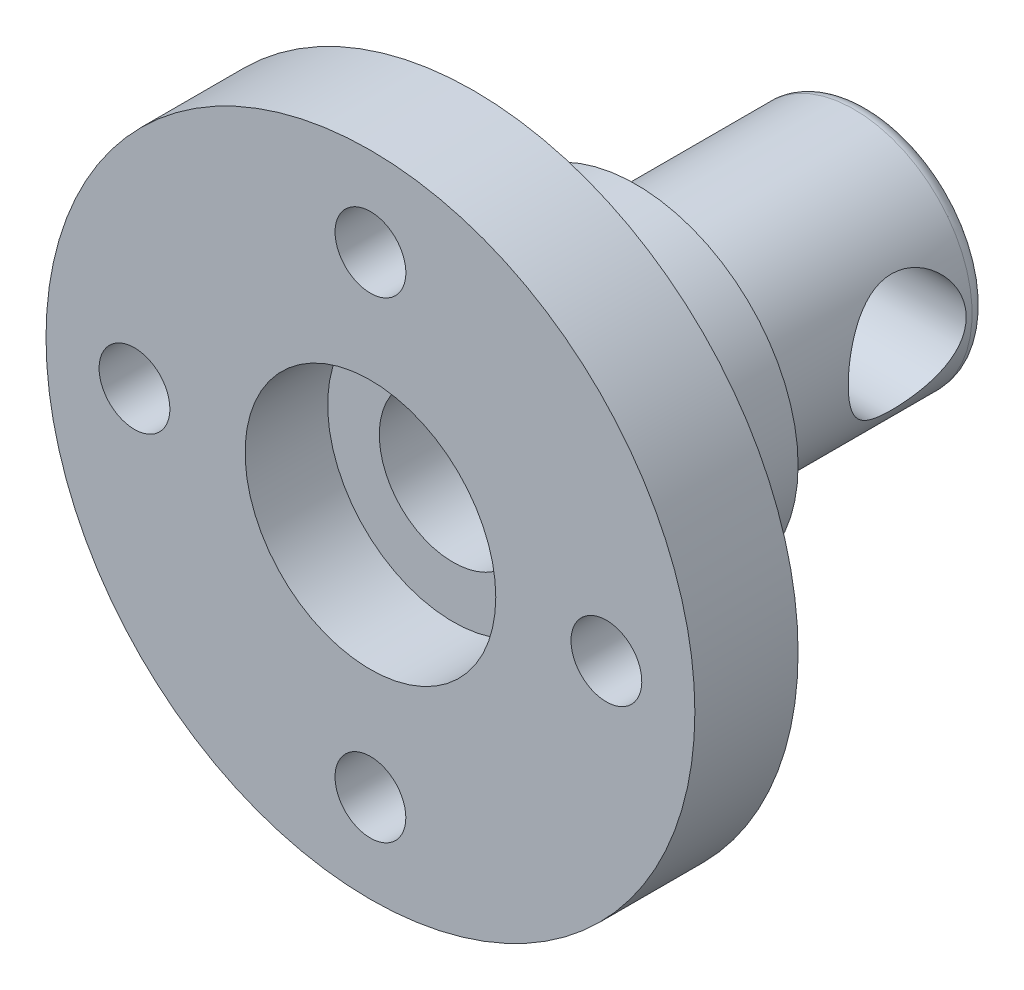
ISO-10303-21;
HEADER;
FILE_DESCRIPTION(('STEP AP214'),'2;1');
FILE_NAME('part.step','',(''),(''),'','','');
FILE_SCHEMA(('AUTOMOTIVE_DESIGN { 1 0 10303 214 1 1 1 1 }'));
ENDSEC;
DATA;
#1=APPLICATION_CONTEXT('core data for automotive mechanical design processes');
#2=APPLICATION_PROTOCOL_DEFINITION('international standard','automotive_design',2000,#1);
#3=PRODUCT_CONTEXT('',#1,'mechanical');
#4=PRODUCT('Part','Part','',(#3));
#5=PRODUCT_RELATED_PRODUCT_CATEGORY('part','',(#4));
#6=PRODUCT_DEFINITION_FORMATION('','',#4);
#7=PRODUCT_DEFINITION_CONTEXT('part definition',#1,'design');
#8=PRODUCT_DEFINITION('design','',#6,#7);
#9=PRODUCT_DEFINITION_SHAPE('','',#8);
#10=(LENGTH_UNIT() NAMED_UNIT(*) SI_UNIT(.MILLI.,.METRE.));
#11=(NAMED_UNIT(*) PLANE_ANGLE_UNIT() SI_UNIT($,.RADIAN.));
#12=(NAMED_UNIT(*) SI_UNIT($,.STERADIAN.) SOLID_ANGLE_UNIT());
#13=UNCERTAINTY_MEASURE_WITH_UNIT(LENGTH_MEASURE(1.E-05),#10,'distance_accuracy_value','');
#14=(GEOMETRIC_REPRESENTATION_CONTEXT(3) GLOBAL_UNCERTAINTY_ASSIGNED_CONTEXT((#13)) GLOBAL_UNIT_ASSIGNED_CONTEXT((#10,
#11,#12)) REPRESENTATION_CONTEXT('',''));
#15=CARTESIAN_POINT('',(0.,0.,0.));
#16=DIRECTION('',(0.,0.,1.));
#17=DIRECTION('',(1.,0.,0.));
#18=AXIS2_PLACEMENT_3D('',#15,#16,#17);
#19=CARTESIAN_POINT('',(0.,0.,3.5));
#20=DIRECTION('',(0.,0.,-1.));
#21=DIRECTION('',(-1.,0.,0.));
#22=AXIS2_PLACEMENT_3D('',#19,#20,#21);
#23=CYLINDRICAL_SURFACE('',#22,11.);
#24=CARTESIAN_POINT('',(0.,0.,3.5));
#25=DIRECTION('',(0.,0.,1.));
#26=DIRECTION('',(1.,0.,0.));
#27=AXIS2_PLACEMENT_3D('',#24,#25,#26);
#28=CIRCLE('',#27,11.);
#29=CARTESIAN_POINT('',(11.,0.,3.5));
#30=VERTEX_POINT('',#29);
#31=EDGE_CURVE('E51',#30,#30,#28,.T.);
#32=ORIENTED_EDGE('',*,*,#31,.F.);
#33=EDGE_LOOP('',(#32));
#34=FACE_BOUND('',#33,.T.);
#35=CARTESIAN_POINT('',(0.,0.,0.));
#36=DIRECTION('',(0.,0.,1.));
#37=DIRECTION('',(1.,0.,0.));
#38=AXIS2_PLACEMENT_3D('',#35,#36,#37);
#39=CIRCLE('',#38,11.);
#40=CARTESIAN_POINT('',(11.,0.,0.));
#41=VERTEX_POINT('',#40);
#42=EDGE_CURVE('E165',#41,#41,#39,.T.);
#43=ORIENTED_EDGE('',*,*,#42,.T.);
#44=EDGE_LOOP('',(#43));
#45=FACE_BOUND('',#44,.T.);
#46=ADVANCED_FACE('F36',(#34,#45),#23,.T.);
#47=CARTESIAN_POINT('',(0.,0.,3.5));
#48=DIRECTION('',(0.,0.,1.));
#49=DIRECTION('',(1.,0.,0.));
#50=AXIS2_PLACEMENT_3D('',#47,#48,#49);
#51=PLANE('',#50);
#52=CARTESIAN_POINT('',(-8.,0.,3.5));
#53=DIRECTION('',(0.,0.,-1.));
#54=DIRECTION('',(0.,-1.,0.));
#55=AXIS2_PLACEMENT_3D('',#52,#53,#54);
#56=CIRCLE('',#55,1.2);
#57=CARTESIAN_POINT('',(-8.,-1.20000000000003,3.5));
#58=VERTEX_POINT('',#57);
#59=EDGE_CURVE('E135',#58,#58,#56,.T.);
#60=ORIENTED_EDGE('',*,*,#59,.T.);
#61=EDGE_LOOP('',(#60));
#62=FACE_BOUND('',#61,.T.);
#63=CARTESIAN_POINT('',(0.,-8.,3.5));
#64=DIRECTION('',(0.,0.,-1.));
#65=DIRECTION('',(1.,0.,0.));
#66=AXIS2_PLACEMENT_3D('',#63,#64,#65);
#67=CIRCLE('',#66,1.2);
#68=CARTESIAN_POINT('',(1.2,-8.,3.5));
#69=VERTEX_POINT('',#68);
#70=EDGE_CURVE('E140',#69,#69,#67,.T.);
#71=ORIENTED_EDGE('',*,*,#70,.T.);
#72=EDGE_LOOP('',(#71));
#73=FACE_BOUND('',#72,.T.);
#74=CARTESIAN_POINT('',(8.,0.,3.5));
#75=DIRECTION('',(0.,0.,-1.));
#76=DIRECTION('',(0.,1.,0.));
#77=AXIS2_PLACEMENT_3D('',#74,#75,#76);
#78=CIRCLE('',#77,1.2);
#79=CARTESIAN_POINT('',(7.99999999999999,1.20000000000008,3.5));
#80=VERTEX_POINT('',#79);
#81=EDGE_CURVE('E151',#80,#80,#78,.T.);
#82=ORIENTED_EDGE('',*,*,#81,.T.);
#83=EDGE_LOOP('',(#82));
#84=FACE_BOUND('',#83,.T.);
#85=CARTESIAN_POINT('',(0.,8.,3.5));
#86=DIRECTION('',(0.,0.,-1.));
#87=DIRECTION('',(-1.,0.,0.));
#88=AXIS2_PLACEMENT_3D('',#85,#86,#87);
#89=CIRCLE('',#88,1.2);
#90=CARTESIAN_POINT('',(-1.2,8.,3.5));
#91=VERTEX_POINT('',#90);
#92=EDGE_CURVE('E156',#91,#91,#89,.T.);
#93=ORIENTED_EDGE('',*,*,#92,.T.);
#94=EDGE_LOOP('',(#93));
#95=FACE_BOUND('',#94,.T.);
#96=CARTESIAN_POINT('',(0.,0.,3.5));
#97=DIRECTION('',(0.,0.,1.));
#98=DIRECTION('',(1.,0.,0.));
#99=AXIS2_PLACEMENT_3D('',#96,#97,#98);
#100=CIRCLE('',#99,4.25);
#101=CARTESIAN_POINT('',(4.25,0.,3.5));
#102=VERTEX_POINT('',#101);
#103=EDGE_CURVE('E159',#102,#102,#100,.T.);
#104=ORIENTED_EDGE('',*,*,#103,.F.);
#105=EDGE_LOOP('',(#104));
#106=FACE_BOUND('',#105,.T.);
#107=ORIENTED_EDGE('',*,*,#31,.T.);
#108=EDGE_LOOP('',(#107));
#109=FACE_BOUND('',#108,.T.);
#110=ADVANCED_FACE('F92',(#62,#73,#84,#95,#106,#109),#51,.T.);
#111=CARTESIAN_POINT('',(0.,0.,0.));
#112=DIRECTION('',(0.,0.,1.));
#113=DIRECTION('',(1.,0.,0.));
#114=AXIS2_PLACEMENT_3D('',#111,#112,#113);
#115=PLANE('',#114);
#116=CARTESIAN_POINT('',(0.,0.,0.));
#117=DIRECTION('',(0.,0.,1.));
#118=DIRECTION('',(1.,0.,0.));
#119=AXIS2_PLACEMENT_3D('',#116,#117,#118);
#120=CIRCLE('',#119,5.5);
#121=CARTESIAN_POINT('',(5.5,0.,0.));
#122=VERTEX_POINT('',#121);
#123=EDGE_CURVE('E47',#122,#122,#120,.F.);
#124=ORIENTED_EDGE('',*,*,#123,.F.);
#125=EDGE_LOOP('',(#124));
#126=FACE_BOUND('',#125,.T.);
#127=CARTESIAN_POINT('',(-8.,0.,0.));
#128=DIRECTION('',(0.,0.,-1.));
#129=DIRECTION('',(0.,-1.,0.));
#130=AXIS2_PLACEMENT_3D('',#127,#128,#129);
#131=CIRCLE('',#130,1.2);
#132=CARTESIAN_POINT('',(-8.,-1.20000000000003,0.));
#133=VERTEX_POINT('',#132);
#134=EDGE_CURVE('E138',#133,#133,#131,.T.);
#135=ORIENTED_EDGE('',*,*,#134,.F.);
#136=EDGE_LOOP('',(#135));
#137=FACE_BOUND('',#136,.T.);
#138=CARTESIAN_POINT('',(0.,-8.,0.));
#139=DIRECTION('',(0.,0.,-1.));
#140=DIRECTION('',(1.,0.,0.));
#141=AXIS2_PLACEMENT_3D('',#138,#139,#140);
#142=CIRCLE('',#141,1.2);
#143=CARTESIAN_POINT('',(1.2,-8.,0.));
#144=VERTEX_POINT('',#143);
#145=EDGE_CURVE('E145',#144,#144,#142,.T.);
#146=ORIENTED_EDGE('',*,*,#145,.F.);
#147=EDGE_LOOP('',(#146));
#148=FACE_BOUND('',#147,.T.);
#149=CARTESIAN_POINT('',(8.,0.,0.));
#150=DIRECTION('',(0.,0.,-1.));
#151=DIRECTION('',(0.,1.,0.));
#152=AXIS2_PLACEMENT_3D('',#149,#150,#151);
#153=CIRCLE('',#152,1.2);
#154=CARTESIAN_POINT('',(7.99999999999999,1.20000000000008,0.));
#155=VERTEX_POINT('',#154);
#156=EDGE_CURVE('E67',#155,#155,#153,.T.);
#157=ORIENTED_EDGE('',*,*,#156,.F.);
#158=EDGE_LOOP('',(#157));
#159=FACE_BOUND('',#158,.T.);
#160=CARTESIAN_POINT('',(0.,8.,0.));
#161=DIRECTION('',(0.,0.,-1.));
#162=DIRECTION('',(-1.,0.,0.));
#163=AXIS2_PLACEMENT_3D('',#160,#161,#162);
#164=CIRCLE('',#163,1.2);
#165=CARTESIAN_POINT('',(-1.2,8.,0.));
#166=VERTEX_POINT('',#165);
#167=EDGE_CURVE('E142',#166,#166,#164,.T.);
#168=ORIENTED_EDGE('',*,*,#167,.F.);
#169=EDGE_LOOP('',(#168));
#170=FACE_BOUND('',#169,.T.);
#171=ORIENTED_EDGE('',*,*,#42,.F.);
#172=EDGE_LOOP('',(#171));
#173=FACE_BOUND('',#172,.T.);
#174=ADVANCED_FACE('F97',(#126,#137,#148,#159,#170,#173),#115,.F.);
#175=CARTESIAN_POINT('',(0.,0.,0.7));
#176=DIRECTION('',(0.,0.,1.));
#177=DIRECTION('',(1.,0.,0.));
#178=AXIS2_PLACEMENT_3D('',#175,#176,#177);
#179=CYLINDRICAL_SURFACE('',#178,4.25);
#180=CARTESIAN_POINT('',(0.,0.,0.7));
#181=DIRECTION('',(0.,0.,1.));
#182=DIRECTION('',(1.,0.,0.));
#183=AXIS2_PLACEMENT_3D('',#180,#181,#182);
#184=CIRCLE('',#183,4.25);
#185=CARTESIAN_POINT('',(4.25,0.,0.7));
#186=VERTEX_POINT('',#185);
#187=EDGE_CURVE('E162',#186,#186,#184,.T.);
#188=ORIENTED_EDGE('',*,*,#187,.F.);
#189=EDGE_LOOP('',(#188));
#190=FACE_BOUND('',#189,.T.);
#191=ORIENTED_EDGE('',*,*,#103,.T.);
#192=EDGE_LOOP('',(#191));
#193=FACE_BOUND('',#192,.T.);
#194=ADVANCED_FACE('F104',(#190,#193),#179,.F.);
#195=CARTESIAN_POINT('',(0.,0.,0.7));
#196=DIRECTION('',(0.,0.,1.));
#197=DIRECTION('',(1.,0.,0.));
#198=AXIS2_PLACEMENT_3D('',#195,#196,#197);
#199=PLANE('',#198);
#200=CARTESIAN_POINT('',(0.,0.,0.7));
#201=DIRECTION('',(0.,0.,1.));
#202=DIRECTION('',(1.,0.,0.));
#203=AXIS2_PLACEMENT_3D('',#200,#201,#202);
#204=CIRCLE('',#203,2.5);
#205=CARTESIAN_POINT('',(2.5,0.,0.7));
#206=VERTEX_POINT('',#205);
#207=EDGE_CURVE('E194',#206,#206,#204,.T.);
#208=ORIENTED_EDGE('',*,*,#207,.F.);
#209=EDGE_LOOP('',(#208));
#210=FACE_BOUND('',#209,.T.);
#211=ORIENTED_EDGE('',*,*,#187,.T.);
#212=EDGE_LOOP('',(#211));
#213=FACE_BOUND('',#212,.T.);
#214=ADVANCED_FACE('F109',(#210,#213),#199,.T.);
#215=CARTESIAN_POINT('',(0.,8.,3.5));
#216=DIRECTION('',(0.,0.,-1.));
#217=DIRECTION('',(-1.,0.,0.));
#218=AXIS2_PLACEMENT_3D('',#215,#216,#217);
#219=CYLINDRICAL_SURFACE('',#218,1.2);
#220=ORIENTED_EDGE('',*,*,#92,.F.);
#221=EDGE_LOOP('',(#220));
#222=FACE_BOUND('',#221,.T.);
#223=ORIENTED_EDGE('',*,*,#167,.T.);
#224=EDGE_LOOP('',(#223));
#225=FACE_BOUND('',#224,.T.);
#226=ADVANCED_FACE('F113',(#222,#225),#219,.F.);
#227=CARTESIAN_POINT('',(8.,0.,3.5));
#228=DIRECTION('',(0.,0.,-1.));
#229=DIRECTION('',(-1.,0.,0.));
#230=AXIS2_PLACEMENT_3D('',#227,#228,#229);
#231=CYLINDRICAL_SURFACE('',#230,1.2);
#232=ORIENTED_EDGE('',*,*,#81,.F.);
#233=EDGE_LOOP('',(#232));
#234=FACE_BOUND('',#233,.T.);
#235=ORIENTED_EDGE('',*,*,#156,.T.);
#236=EDGE_LOOP('',(#235));
#237=FACE_BOUND('',#236,.T.);
#238=ADVANCED_FACE('F117',(#234,#237),#231,.F.);
#239=CARTESIAN_POINT('',(0.,-8.,3.5));
#240=DIRECTION('',(0.,0.,-1.));
#241=DIRECTION('',(-1.,0.,0.));
#242=AXIS2_PLACEMENT_3D('',#239,#240,#241);
#243=CYLINDRICAL_SURFACE('',#242,1.2);
#244=ORIENTED_EDGE('',*,*,#70,.F.);
#245=EDGE_LOOP('',(#244));
#246=FACE_BOUND('',#245,.T.);
#247=ORIENTED_EDGE('',*,*,#145,.T.);
#248=EDGE_LOOP('',(#247));
#249=FACE_BOUND('',#248,.T.);
#250=ADVANCED_FACE('F121',(#246,#249),#243,.F.);
#251=CARTESIAN_POINT('',(-8.,0.,3.5));
#252=DIRECTION('',(0.,0.,-1.));
#253=DIRECTION('',(-1.,0.,0.));
#254=AXIS2_PLACEMENT_3D('',#251,#252,#253);
#255=CYLINDRICAL_SURFACE('',#254,1.2);
#256=ORIENTED_EDGE('',*,*,#59,.F.);
#257=EDGE_LOOP('',(#256));
#258=FACE_BOUND('',#257,.T.);
#259=ORIENTED_EDGE('',*,*,#134,.T.);
#260=EDGE_LOOP('',(#259));
#261=FACE_BOUND('',#260,.T.);
#262=ADVANCED_FACE('F124',(#258,#261),#255,.F.);
#263=CARTESIAN_POINT('',(0.,0.,-5.5));
#264=DIRECTION('',(0.,0.,1.));
#265=DIRECTION('',(1.,0.,0.));
#266=AXIS2_PLACEMENT_3D('',#263,#264,#265);
#267=CYLINDRICAL_SURFACE('',#266,5.5);
#268=CARTESIAN_POINT('',(0.,0.,-5.5));
#269=DIRECTION('',(0.,0.,-1.));
#270=DIRECTION('',(-1.,0.,0.));
#271=AXIS2_PLACEMENT_3D('',#268,#269,#270);
#272=CIRCLE('',#271,5.5);
#273=CARTESIAN_POINT('',(-5.5,0.,-5.5));
#274=VERTEX_POINT('',#273);
#275=EDGE_CURVE('E58',#274,#274,#272,.T.);
#276=ORIENTED_EDGE('',*,*,#275,.F.);
#277=EDGE_LOOP('',(#276));
#278=FACE_BOUND('',#277,.T.);
#279=ORIENTED_EDGE('',*,*,#123,.T.);
#280=EDGE_LOOP('',(#279));
#281=FACE_BOUND('',#280,.T.);
#282=ADVANCED_FACE('F82',(#278,#281),#267,.T.);
#283=CARTESIAN_POINT('',(0.,0.,-5.5));
#284=DIRECTION('',(0.,0.,-1.));
#285=DIRECTION('',(-1.,0.,0.));
#286=AXIS2_PLACEMENT_3D('',#283,#284,#285);
#287=PLANE('',#286);
#288=CARTESIAN_POINT('',(0.,0.,-5.5));
#289=DIRECTION('',(0.,0.,-1.));
#290=DIRECTION('',(-1.,0.,0.));
#291=AXIS2_PLACEMENT_3D('',#288,#289,#290);
#292=CIRCLE('',#291,4.);
#293=CARTESIAN_POINT('',(-4.,0.,-5.5));
#294=VERTEX_POINT('',#293);
#295=EDGE_CURVE('E54',#294,#294,#292,.T.);
#296=ORIENTED_EDGE('',*,*,#295,.F.);
#297=EDGE_LOOP('',(#296));
#298=FACE_BOUND('',#297,.T.);
#299=ORIENTED_EDGE('',*,*,#275,.T.);
#300=EDGE_LOOP('',(#299));
#301=FACE_BOUND('',#300,.T.);
#302=ADVANCED_FACE('F86',(#298,#301),#287,.T.);
#303=CARTESIAN_POINT('',(0.,0.,-13.4));
#304=DIRECTION('',(0.,0.,-1.));
#305=DIRECTION('',(-1.,0.,0.));
#306=AXIS2_PLACEMENT_3D('',#303,#304,#305);
#307=PLANE('',#306);
#308=CARTESIAN_POINT('',(0.,0.,-13.4));
#309=DIRECTION('',(0.,0.,-1.));
#310=DIRECTION('',(-1.,0.,0.));
#311=AXIS2_PLACEMENT_3D('',#308,#309,#310);
#312=CIRCLE('',#311,3.5);
#313=CARTESIAN_POINT('',(-3.5,0.,-13.4));
#314=VERTEX_POINT('',#313);
#315=EDGE_CURVE('E43',#314,#314,#312,.T.);
#316=ORIENTED_EDGE('',*,*,#315,.T.);
#317=EDGE_LOOP('',(#316));
#318=FACE_BOUND('',#317,.T.);
#319=ADVANCED_FACE('F80',(#318),#307,.T.);
#320=CARTESIAN_POINT('',(-11.,0.,-10.7));
#321=DIRECTION('',(1.,0.,0.));
#322=DIRECTION('',(0.,0.,-1.));
#323=AXIS2_PLACEMENT_3D('',#320,#321,#322);
#324=CYLINDRICAL_SURFACE('',#323,2.);
#325=CARTESIAN_POINT('',(-4.,0.,-12.7));
#326=CARTESIAN_POINT('',(-3.99999426810082,0.105143925902467,-12.6999933953656));
#327=CARTESIAN_POINT('',(-3.99580982039513,0.210413199395125,-12.6916598537579));
#328=CARTESIAN_POINT('',(-3.97948312074314,0.417840470537792,-12.6586942393169));
#329=CARTESIAN_POINT('',(-3.96732575657839,0.519992173427259,-12.6340312140044));
#330=CARTESIAN_POINT('',(-3.93632558806751,0.717867089760897,-12.5696123827667));
#331=CARTESIAN_POINT('',(-3.91750878355075,0.813613605878292,-12.5299152315041));
#332=CARTESIAN_POINT('',(-3.87491553031523,0.996945233613198,-12.43685875727));
#333=CARTESIAN_POINT('',(-3.8511394726705,1.08453098798012,-12.3835005115023));
#334=CARTESIAN_POINT('',(-3.79912516516124,1.25501563552382,-12.2609655010294));
#335=CARTESIAN_POINT('',(-3.77070398255074,1.33731042224422,-12.1910270415207));
#336=CARTESIAN_POINT('',(-3.71319940493486,1.48955888973396,-12.0389570415059));
#337=CARTESIAN_POINT('',(-3.68411552418069,1.55950316621353,-11.9568162964551));
#338=CARTESIAN_POINT('',(-3.62597902394695,1.69050400090056,-11.7750333009532));
#339=CARTESIAN_POINT('',(-3.59710373940264,1.75045067110327,-11.6745278033082));
#340=CARTESIAN_POINT('',(-3.54571957544641,1.85233645378139,-11.4632653280276));
#341=CARTESIAN_POINT('',(-3.52320615213979,1.89428842993267,-11.3525157425545));
#342=CARTESIAN_POINT('',(-3.48915734075617,1.95626488437718,-11.1306697891562));
#343=CARTESIAN_POINT('',(-3.47704543167427,1.97745171416088,-11.0199910958652));
#344=CARTESIAN_POINT('',(-3.46363779897055,2.00085398661769,-10.796042324441));
#345=CARTESIAN_POINT('',(-3.46233138686576,2.00308817674615,-10.6827749182577));
#346=CARTESIAN_POINT('',(-3.47021860514497,1.98937457434459,-10.4714279513693));
#347=CARTESIAN_POINT('',(-3.47817527324027,1.97556911907364,-10.3731519375539));
#348=CARTESIAN_POINT('',(-3.50152457467701,1.93387969811386,-10.1805561812539));
#349=CARTESIAN_POINT('',(-3.51691957663553,1.9059912477953,-10.0862377093894));
#350=CARTESIAN_POINT('',(-3.55374952825482,1.83641956077201,-9.90154173486868));
#351=CARTESIAN_POINT('',(-3.57531681327997,1.79443013423199,-9.81130720242842));
#352=CARTESIAN_POINT('',(-3.62206808562807,1.698083375336,-9.63873141481998));
#353=CARTESIAN_POINT('',(-3.64725369560381,1.64372048762493,-9.55639372879982));
#354=CARTESIAN_POINT('',(-3.70226315806572,1.51613210982558,-9.39095749451355));
#355=CARTESIAN_POINT('',(-3.73227020473492,1.44138891673856,-9.30908625284768));
#356=CARTESIAN_POINT('',(-3.79095246600814,1.27911115748275,-9.15852916281819));
#357=CARTESIAN_POINT('',(-3.81962703917602,1.19157051314857,-9.08984961593223));
#358=CARTESIAN_POINT('',(-3.87403974565928,1.0010330116637,-8.96462867794054));
#359=CARTESIAN_POINT('',(-3.89957968324015,0.897507183198817,-8.90879905510852));
#360=CARTESIAN_POINT('',(-3.94315762242485,0.680932430977593,-8.81580594191398));
#361=CARTESIAN_POINT('',(-3.96120157887106,0.567891152530552,-8.77862762996967));
#362=CARTESIAN_POINT('',(-3.98648667482871,0.345532983321405,-8.72704919256665));
#363=CARTESIAN_POINT('',(-3.9944987660262,0.236683061096652,-8.71101752850644));
#364=CARTESIAN_POINT('',(-4.00146026918207,0.0175591998987031,-8.69707053773103));
#365=CARTESIAN_POINT('',(-4.00041397442637,-0.0927140397398177,-8.69914662872106));
#366=CARTESIAN_POINT('',(-3.9898238450687,-0.302465943971974,-8.72041337683749));
#367=CARTESIAN_POINT('',(-3.98094491376337,-0.40211881609986,-8.73826506545999));
#368=CARTESIAN_POINT('',(-3.9564434262968,-0.596813784603882,-8.78847614379024));
#369=CARTESIAN_POINT('',(-3.94082012668824,-0.691855371382174,-8.82083713290699));
#370=CARTESIAN_POINT('',(-3.90368502827176,-0.877777216899145,-8.89999693286607));
#371=CARTESIAN_POINT('',(-3.88201763539261,-0.968460794011607,-8.94718210023258));
#372=CARTESIAN_POINT('',(-3.83487948634835,-1.14092272339854,-9.05421507129314));
#373=CARTESIAN_POINT('',(-3.80940711133877,-1.22269725955318,-9.11406826919079));
#374=CARTESIAN_POINT('',(-3.75416442672396,-1.38353537857843,-9.25152085066143));
#375=CARTESIAN_POINT('',(-3.72421769686998,-1.46154415563805,-9.3302857368903));
#376=CARTESIAN_POINT('',(-3.6652478321764,-1.60371264223771,-9.49985030255546));
#377=CARTESIAN_POINT('',(-3.63622534800094,-1.66786277142375,-9.59065823769584));
#378=CARTESIAN_POINT('',(-3.58102384412979,-1.78341582895804,-9.78728730834595));
#379=CARTESIAN_POINT('',(-3.55505059178121,-1.8340509916005,-9.89362253218896));
#380=CARTESIAN_POINT('',(-3.51148144588269,-1.91616565186941,-10.1150201351499));
#381=CARTESIAN_POINT('',(-3.493874764435,-1.94766983173403,-10.2300710529338));
#382=CARTESIAN_POINT('',(-3.47123002051604,-1.98772337493374,-10.4538204457694));
#383=CARTESIAN_POINT('',(-3.4651476693013,-1.9981859928109,-10.5620685068705));
#384=CARTESIAN_POINT('',(-3.46330709283206,-2.0013783087524,-10.778894134329));
#385=CARTESIAN_POINT('',(-3.4675443925278,-1.99411569324648,-10.8874715374757));
#386=CARTESIAN_POINT('',(-3.48475724102153,-1.96385225118662,-11.0909670030669));
#387=CARTESIAN_POINT('',(-3.49686188965317,-1.94241662868607,-11.1862009402895));
#388=CARTESIAN_POINT('',(-3.52742032375305,-1.88635071644882,-11.3716162388487));
#389=CARTESIAN_POINT('',(-3.54587615139337,-1.85171618231984,-11.4617959641841));
#390=CARTESIAN_POINT('',(-3.58857060729071,-1.76763149060113,-11.6412497019731));
#391=CARTESIAN_POINT('',(-3.61311444791841,-1.7173422756314,-11.7300558036581));
#392=CARTESIAN_POINT('',(-3.66470663269721,-1.60430194327478,-11.8985490723625));
#393=CARTESIAN_POINT('',(-3.69175627591221,-1.54154434248312,-11.9782314610422));
#394=CARTESIAN_POINT('',(-3.74924646316184,-1.39640665332275,-12.1362839647093));
#395=CARTESIAN_POINT('',(-3.77969966613256,-1.31256884599452,-12.2133182047006));
#396=CARTESIAN_POINT('',(-3.83755504519861,-1.13230961246639,-12.3525259668705));
#397=CARTESIAN_POINT('',(-3.8649555725239,-1.03588144661039,-12.4146914789398));
#398=CARTESIAN_POINT('',(-3.91396019133075,-0.831863193565892,-12.5224727254241));
#399=CARTESIAN_POINT('',(-3.93552192987866,-0.724199007553462,-12.5679683384729));
#400=CARTESIAN_POINT('',(-3.97002682597974,-0.501484202276173,-12.6396163355148));
#401=CARTESIAN_POINT('',(-3.98299446726136,-0.3864555991782,-12.6658236936114));
#402=CARTESIAN_POINT('',(-3.99390923826956,-0.22520389298179,-12.6877948221715));
#403=CARTESIAN_POINT('',(-3.99618730680502,-0.180323758883129,-12.6923652817327));
#404=CARTESIAN_POINT('',(-3.99923393953631,-0.090303463610183,-12.6984693310282));
#405=CARTESIAN_POINT('',(-4.00000246206762,-0.0451632952932568,-12.7000028369404));
#406=CARTESIAN_POINT('',(-4.,0.,-12.7));
#407=B_SPLINE_CURVE_WITH_KNOTS('',3,(#325,#326,#327,#328,#329,#330,#331,#332,#333,#334,#335,
#336,#337,#338,#339,#340,#341,#342,#343,#344,#345,#346,#347,#348,#349,#350,#351,#352,#353,#354,
#355,#356,#357,#358,#359,#360,#361,#362,#363,#364,#365,#366,#367,#368,#369,#370,#371,#372,#373,
#374,#375,#376,#377,#378,#379,#380,#381,#382,#383,#384,#385,#386,#387,#388,#389,#390,#391,#392,
#393,#394,#395,#396,#397,#398,#399,#400,#401,#402,#403,#404,#405,#406),.UNSPECIFIED.,.T.,.F.,(4,
2,2,2,2,2,2,2,2,2,2,2,2,2,2,2,2,2,2,2,2,2,2,2,2,2,2,2,2,2,2,2,2,2,2,2,2,2,2,2,4),(0.,
0.315248514840585,0.631096299418396,0.945724310984597,1.26032752116314,1.59396351743618,
1.92785247530807,2.28763452861505,2.64715895796562,2.98516024280459,3.32282714658041,
3.62011424818641,3.91749607851357,4.22180480336975,4.52625042520444,4.86929882667757,
5.21251069197373,5.57166044428881,5.93052433824559,6.25966580942691,6.58865129022952,
6.89213813012244,7.19565843261863,7.50785712055797,7.82018901496678,8.16319221288838,
8.50643177230863,8.86629364323451,9.22569023890901,9.55058615006093,9.87534119729357,
10.1691586049771,10.463070575767,10.7767291356057,11.0905512228726,11.4425048551434,
11.7946476676249,12.1492802732705,12.502898172423,12.6383056026783,12.7737167702213),.UNSPECIFIED.);
#408=CARTESIAN_POINT('',(-4.,0.,-12.7));
#409=VERTEX_POINT('',#408);
#410=EDGE_CURVE('E57',#409,#409,#407,.T.);
#411=ORIENTED_EDGE('',*,*,#410,.F.);
#412=EDGE_LOOP('',(#411));
#413=FACE_BOUND('',#412,.T.);
#414=CARTESIAN_POINT('',(4.,0.,-12.7));
#415=CARTESIAN_POINT('',(3.99999426810082,-0.105143925902467,-12.6999933953656));
#416=CARTESIAN_POINT('',(3.99580982039513,-0.210413199395125,-12.6916598537579));
#417=CARTESIAN_POINT('',(3.97948312074314,-0.417840470537792,-12.6586942393169));
#418=CARTESIAN_POINT('',(3.96732575657839,-0.519992173427259,-12.6340312140044));
#419=CARTESIAN_POINT('',(3.93632558806751,-0.717867089760897,-12.5696123827667));
#420=CARTESIAN_POINT('',(3.91750878355075,-0.813613605878292,-12.5299152315041));
#421=CARTESIAN_POINT('',(3.87491553031523,-0.996945233613198,-12.43685875727));
#422=CARTESIAN_POINT('',(3.8511394726705,-1.08453098798012,-12.3835005115023));
#423=CARTESIAN_POINT('',(3.79912516516124,-1.25501563552382,-12.2609655010294));
#424=CARTESIAN_POINT('',(3.77070398255074,-1.33731042224422,-12.1910270415207));
#425=CARTESIAN_POINT('',(3.71319940493486,-1.48955888973396,-12.0389570415059));
#426=CARTESIAN_POINT('',(3.68411552418069,-1.55950316621353,-11.9568162964551));
#427=CARTESIAN_POINT('',(3.62597902394695,-1.69050400090056,-11.7750333009532));
#428=CARTESIAN_POINT('',(3.59710373940264,-1.75045067110327,-11.6745278033082));
#429=CARTESIAN_POINT('',(3.54571957544641,-1.85233645378139,-11.4632653280276));
#430=CARTESIAN_POINT('',(3.52320615213979,-1.89428842993267,-11.3525157425545));
#431=CARTESIAN_POINT('',(3.48915734075617,-1.95626488437718,-11.1306697891562));
#432=CARTESIAN_POINT('',(3.47704543167427,-1.97745171416088,-11.0199910958652));
#433=CARTESIAN_POINT('',(3.46363779897055,-2.00085398661769,-10.796042324441));
#434=CARTESIAN_POINT('',(3.46233138686576,-2.00308817674615,-10.6827749182577));
#435=CARTESIAN_POINT('',(3.47021860514497,-1.98937457434459,-10.4714279513693));
#436=CARTESIAN_POINT('',(3.47817527324027,-1.97556911907364,-10.3731519375539));
#437=CARTESIAN_POINT('',(3.50152457467701,-1.93387969811386,-10.1805561812539));
#438=CARTESIAN_POINT('',(3.51691957663553,-1.9059912477953,-10.0862377093894));
#439=CARTESIAN_POINT('',(3.55374952825482,-1.83641956077201,-9.90154173486868));
#440=CARTESIAN_POINT('',(3.57531681327997,-1.79443013423199,-9.81130720242842));
#441=CARTESIAN_POINT('',(3.62206808562807,-1.698083375336,-9.63873141481998));
#442=CARTESIAN_POINT('',(3.64725369560381,-1.64372048762493,-9.55639372879982));
#443=CARTESIAN_POINT('',(3.70226315806572,-1.51613210982558,-9.39095749451355));
#444=CARTESIAN_POINT('',(3.73227020473492,-1.44138891673856,-9.30908625284768));
#445=CARTESIAN_POINT('',(3.79095246600814,-1.27911115748275,-9.15852916281819));
#446=CARTESIAN_POINT('',(3.81962703917602,-1.19157051314857,-9.08984961593223));
#447=CARTESIAN_POINT('',(3.87403974565928,-1.0010330116637,-8.96462867794054));
#448=CARTESIAN_POINT('',(3.89957968324015,-0.897507183198817,-8.90879905510852));
#449=CARTESIAN_POINT('',(3.94315762242485,-0.680932430977593,-8.81580594191398));
#450=CARTESIAN_POINT('',(3.96120157887106,-0.567891152530552,-8.77862762996967));
#451=CARTESIAN_POINT('',(3.98648667482871,-0.345532983321405,-8.72704919256665));
#452=CARTESIAN_POINT('',(3.9944987660262,-0.236683061096652,-8.71101752850644));
#453=CARTESIAN_POINT('',(4.00146026918207,-0.0175591998987031,-8.69707053773103));
#454=CARTESIAN_POINT('',(4.00041397442637,0.0927140397398177,-8.69914662872106));
#455=CARTESIAN_POINT('',(3.9898238450687,0.302465943971974,-8.72041337683749));
#456=CARTESIAN_POINT('',(3.98094491376337,0.40211881609986,-8.73826506545999));
#457=CARTESIAN_POINT('',(3.9564434262968,0.596813784603882,-8.78847614379024));
#458=CARTESIAN_POINT('',(3.94082012668824,0.691855371382174,-8.82083713290699));
#459=CARTESIAN_POINT('',(3.90368502827176,0.877777216899145,-8.89999693286607));
#460=CARTESIAN_POINT('',(3.88201763539261,0.968460794011607,-8.94718210023258));
#461=CARTESIAN_POINT('',(3.83487948634835,1.14092272339854,-9.05421507129314));
#462=CARTESIAN_POINT('',(3.80940711133877,1.22269725955318,-9.11406826919079));
#463=CARTESIAN_POINT('',(3.75416442672396,1.38353537857843,-9.25152085066143));
#464=CARTESIAN_POINT('',(3.72421769686998,1.46154415563805,-9.3302857368903));
#465=CARTESIAN_POINT('',(3.6652478321764,1.60371264223771,-9.49985030255546));
#466=CARTESIAN_POINT('',(3.63622534800094,1.66786277142375,-9.59065823769584));
#467=CARTESIAN_POINT('',(3.58102384412979,1.78341582895804,-9.78728730834595));
#468=CARTESIAN_POINT('',(3.55505059178121,1.8340509916005,-9.89362253218896));
#469=CARTESIAN_POINT('',(3.51148144588269,1.91616565186941,-10.1150201351499));
#470=CARTESIAN_POINT('',(3.493874764435,1.94766983173403,-10.2300710529338));
#471=CARTESIAN_POINT('',(3.47123002051604,1.98772337493374,-10.4538204457694));
#472=CARTESIAN_POINT('',(3.4651476693013,1.9981859928109,-10.5620685068705));
#473=CARTESIAN_POINT('',(3.46330709283206,2.0013783087524,-10.778894134329));
#474=CARTESIAN_POINT('',(3.4675443925278,1.99411569324648,-10.8874715374757));
#475=CARTESIAN_POINT('',(3.48475724102153,1.96385225118662,-11.0909670030669));
#476=CARTESIAN_POINT('',(3.49686188965317,1.94241662868607,-11.1862009402895));
#477=CARTESIAN_POINT('',(3.52742032375305,1.88635071644882,-11.3716162388487));
#478=CARTESIAN_POINT('',(3.54587615139337,1.85171618231984,-11.4617959641841));
#479=CARTESIAN_POINT('',(3.58857060729071,1.76763149060113,-11.6412497019731));
#480=CARTESIAN_POINT('',(3.61311444791841,1.7173422756314,-11.7300558036581));
#481=CARTESIAN_POINT('',(3.66470663269721,1.60430194327478,-11.8985490723625));
#482=CARTESIAN_POINT('',(3.69175627591221,1.54154434248312,-11.9782314610422));
#483=CARTESIAN_POINT('',(3.74924646316184,1.39640665332275,-12.1362839647093));
#484=CARTESIAN_POINT('',(3.77969966613256,1.31256884599452,-12.2133182047006));
#485=CARTESIAN_POINT('',(3.83755504519861,1.13230961246639,-12.3525259668705));
#486=CARTESIAN_POINT('',(3.8649555725239,1.03588144661039,-12.4146914789398));
#487=CARTESIAN_POINT('',(3.91396019133075,0.831863193565892,-12.5224727254241));
#488=CARTESIAN_POINT('',(3.93552192987866,0.724199007553462,-12.5679683384729));
#489=CARTESIAN_POINT('',(3.97002682597974,0.501484202276173,-12.6396163355148));
#490=CARTESIAN_POINT('',(3.98299446726136,0.3864555991782,-12.6658236936114));
#491=CARTESIAN_POINT('',(3.99390923826956,0.22520389298179,-12.6877948221715));
#492=CARTESIAN_POINT('',(3.99618730680502,0.180323758883129,-12.6923652817327));
#493=CARTESIAN_POINT('',(3.99923393953631,0.090303463610183,-12.6984693310282));
#494=CARTESIAN_POINT('',(4.00000246206762,0.0451632952932568,-12.7000028369404));
#495=CARTESIAN_POINT('',(4.,0.,-12.7));
#496=B_SPLINE_CURVE_WITH_KNOTS('',3,(#414,#415,#416,#417,#418,#419,#420,#421,#422,#423,#424,
#425,#426,#427,#428,#429,#430,#431,#432,#433,#434,#435,#436,#437,#438,#439,#440,#441,#442,#443,
#444,#445,#446,#447,#448,#449,#450,#451,#452,#453,#454,#455,#456,#457,#458,#459,#460,#461,#462,
#463,#464,#465,#466,#467,#468,#469,#470,#471,#472,#473,#474,#475,#476,#477,#478,#479,#480,#481,
#482,#483,#484,#485,#486,#487,#488,#489,#490,#491,#492,#493,#494,#495),.UNSPECIFIED.,.T.,.F.,(4,
2,2,2,2,2,2,2,2,2,2,2,2,2,2,2,2,2,2,2,2,2,2,2,2,2,2,2,2,2,2,2,2,2,2,2,2,2,2,2,4),(0.,
0.315248514840585,0.631096299418396,0.945724310984597,1.26032752116314,1.59396351743618,
1.92785247530807,2.28763452861505,2.64715895796562,2.98516024280459,3.32282714658041,
3.62011424818641,3.91749607851357,4.22180480336975,4.52625042520444,4.86929882667757,
5.21251069197373,5.57166044428881,5.93052433824559,6.25966580942691,6.58865129022952,
6.89213813012244,7.19565843261863,7.50785712055797,7.82018901496678,8.16319221288838,
8.50643177230863,8.86629364323451,9.22569023890901,9.55058615006093,9.87534119729357,
10.1691586049771,10.463070575767,10.7767291356057,11.0905512228726,11.4425048551434,
11.7946476676249,12.1492802732705,12.502898172423,12.6383056026783,12.7737167702213),.UNSPECIFIED.);
#497=CARTESIAN_POINT('',(4.,0.,-12.7));
#498=VERTEX_POINT('',#497);
#499=EDGE_CURVE('E59',#498,#498,#496,.T.);
#500=ORIENTED_EDGE('',*,*,#499,.F.);
#501=EDGE_LOOP('',(#500));
#502=FACE_BOUND('',#501,.T.);
#503=ADVANCED_FACE('F76',(#413,#502),#324,.F.);
#504=CARTESIAN_POINT('',(0.,0.,-13.4));
#505=DIRECTION('',(0.,0.,1.));
#506=DIRECTION('',(1.,0.,0.));
#507=AXIS2_PLACEMENT_3D('',#504,#505,#506);
#508=CYLINDRICAL_SURFACE('',#507,4.);
#509=CARTESIAN_POINT('',(0.,0.,-12.9));
#510=DIRECTION('',(0.,0.,-1.));
#511=DIRECTION('',(-1.,0.,0.));
#512=AXIS2_PLACEMENT_3D('',#509,#510,#511);
#513=CIRCLE('',#512,4.);
#514=CARTESIAN_POINT('',(-4.,0.,-12.9));
#515=VERTEX_POINT('',#514);
#516=EDGE_CURVE('E10',#515,#515,#513,.F.);
#517=ORIENTED_EDGE('',*,*,#516,.T.);
#518=EDGE_LOOP('',(#517));
#519=FACE_BOUND('',#518,.T.);
#520=ORIENTED_EDGE('',*,*,#295,.T.);
#521=EDGE_LOOP('',(#520));
#522=FACE_BOUND('',#521,.T.);
#523=ORIENTED_EDGE('',*,*,#499,.T.);
#524=EDGE_LOOP('',(#523));
#525=FACE_BOUND('',#524,.T.);
#526=ORIENTED_EDGE('',*,*,#410,.T.);
#527=EDGE_LOOP('',(#526));
#528=FACE_BOUND('',#527,.T.);
#529=ADVANCED_FACE('F72',(#519,#522,#525,#528),#508,.T.);
#530=CARTESIAN_POINT('',(0.,0.,-12.9));
#531=DIRECTION('',(0.,0.,-1.));
#532=DIRECTION('',(-1.,0.,0.));
#533=AXIS2_PLACEMENT_3D('',#530,#531,#532);
#534=TOROIDAL_SURFACE('',#533,3.5,0.5);
#535=ORIENTED_EDGE('',*,*,#516,.F.);
#536=EDGE_LOOP('',(#535));
#537=FACE_BOUND('',#536,.T.);
#538=ORIENTED_EDGE('',*,*,#315,.F.);
#539=EDGE_LOOP('',(#538));
#540=FACE_BOUND('',#539,.T.);
#541=ADVANCED_FACE('F38',(#537,#540),#534,.T.);
#542=CARTESIAN_POINT('',(0.,0.,-1.5));
#543=DIRECTION('',(0.,0.,1.));
#544=DIRECTION('',(1.,0.,0.));
#545=AXIS2_PLACEMENT_3D('',#542,#543,#544);
#546=CYLINDRICAL_SURFACE('',#545,2.5);
#547=CARTESIAN_POINT('',(0.,0.,-1.5));
#548=DIRECTION('',(0.,0.,1.));
#549=DIRECTION('',(1.,0.,0.));
#550=AXIS2_PLACEMENT_3D('',#547,#548,#549);
#551=CIRCLE('',#550,2.5);
#552=CARTESIAN_POINT('',(2.5,0.,-1.5));
#553=VERTEX_POINT('',#552);
#554=EDGE_CURVE('E193',#553,#553,#551,.T.);
#555=ORIENTED_EDGE('',*,*,#554,.F.);
#556=EDGE_LOOP('',(#555));
#557=FACE_BOUND('',#556,.T.);
#558=ORIENTED_EDGE('',*,*,#207,.T.);
#559=EDGE_LOOP('',(#558));
#560=FACE_BOUND('',#559,.T.);
#561=ADVANCED_FACE('F202',(#557,#560),#546,.F.);
#562=CARTESIAN_POINT('',(0.,0.,-1.5));
#563=DIRECTION('',(0.,0.,1.));
#564=DIRECTION('',(1.,0.,0.));
#565=AXIS2_PLACEMENT_3D('',#562,#563,#564);
#566=PLANE('',#565);
#567=ORIENTED_EDGE('',*,*,#554,.T.);
#568=EDGE_LOOP('',(#567));
#569=FACE_BOUND('',#568,.T.);
#570=ADVANCED_FACE('F200',(#569),#566,.T.);
#571=CLOSED_SHELL('',(#46,#110,#174,#194,#214,#226,#238,#250,#262,#282,#302,#319,#503,#529,#541,
#561,#570));
#572=MANIFOLD_SOLID_BREP('B2',#571);
#573=ADVANCED_BREP_SHAPE_REPRESENTATION('',(#18,#572),#14);
#574=SHAPE_DEFINITION_REPRESENTATION(#9,#573);
ENDSEC;
END-ISO-10303-21;
